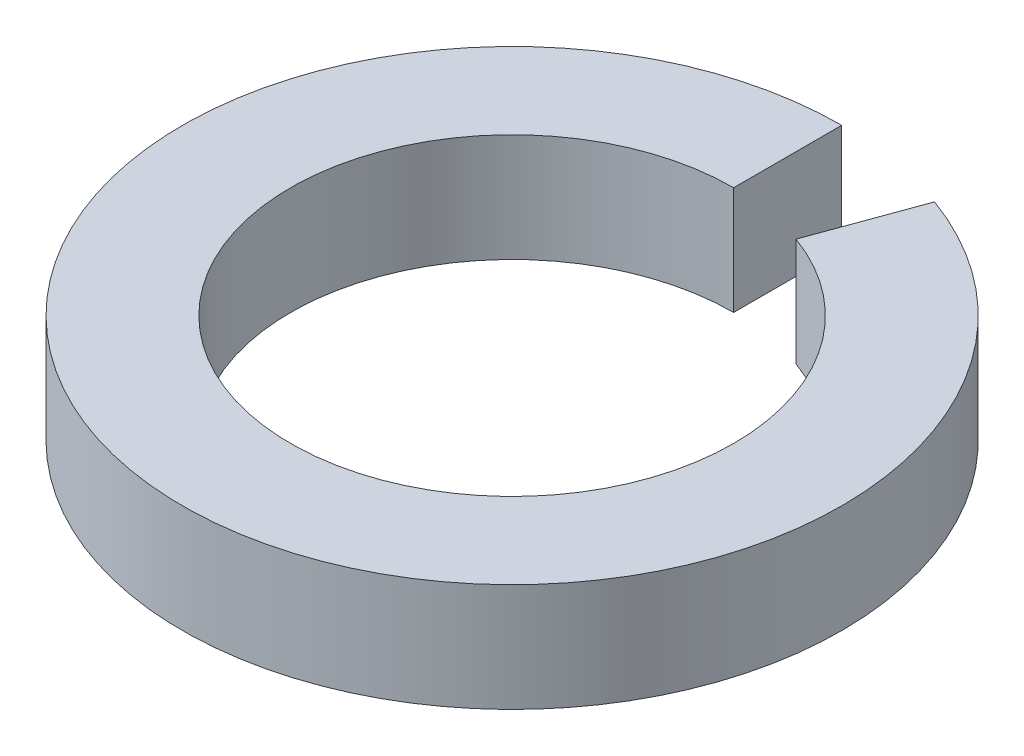
ISO-10303-21;
HEADER;
FILE_DESCRIPTION(('STEP AP214'),'2;1');
FILE_NAME('part.step','',(''),(''),'','','');
FILE_SCHEMA(('AUTOMOTIVE_DESIGN { 1 0 10303 214 1 1 1 1 }'));
ENDSEC;
DATA;
#1=APPLICATION_CONTEXT('core data for automotive mechanical design processes');
#2=APPLICATION_PROTOCOL_DEFINITION('international standard','automotive_design',2000,#1);
#3=PRODUCT_CONTEXT('',#1,'mechanical');
#4=PRODUCT('Part','Part','',(#3));
#5=PRODUCT_RELATED_PRODUCT_CATEGORY('part','',(#4));
#6=PRODUCT_DEFINITION_FORMATION('','',#4);
#7=PRODUCT_DEFINITION_CONTEXT('part definition',#1,'design');
#8=PRODUCT_DEFINITION('design','',#6,#7);
#9=PRODUCT_DEFINITION_SHAPE('','',#8);
#10=(LENGTH_UNIT() NAMED_UNIT(*) SI_UNIT(.MILLI.,.METRE.));
#11=(NAMED_UNIT(*) PLANE_ANGLE_UNIT() SI_UNIT($,.RADIAN.));
#12=(NAMED_UNIT(*) SI_UNIT($,.STERADIAN.) SOLID_ANGLE_UNIT());
#13=UNCERTAINTY_MEASURE_WITH_UNIT(LENGTH_MEASURE(1.E-05),#10,'distance_accuracy_value','');
#14=(GEOMETRIC_REPRESENTATION_CONTEXT(3) GLOBAL_UNCERTAINTY_ASSIGNED_CONTEXT((#13)) GLOBAL_UNIT_ASSIGNED_CONTEXT((#10,
#11,#12)) REPRESENTATION_CONTEXT('',''));
#15=CARTESIAN_POINT('',(0.,0.,0.));
#16=DIRECTION('',(0.,0.,1.));
#17=DIRECTION('',(1.,0.,0.));
#18=AXIS2_PLACEMENT_3D('',#15,#16,#17);
#19=CARTESIAN_POINT('',(0.,2.,0.));
#20=DIRECTION('',(0.,-1.,0.));
#21=DIRECTION('',(0.,0.,-1.));
#22=AXIS2_PLACEMENT_3D('',#19,#20,#21);
#23=CYLINDRICAL_SURFACE('',#22,4.1);
#24=CARTESIAN_POINT('',(0.,0.,0.));
#25=DIRECTION('',(0.,-1.,0.));
#26=DIRECTION('',(0.,0.,1.));
#27=AXIS2_PLACEMENT_3D('',#24,#25,#26);
#28=CIRCLE('',#27,4.1);
#29=CARTESIAN_POINT('',(1.40228258763524,0.,-3.85273974522222));
#30=VERTEX_POINT('',#29);
#31=CARTESIAN_POINT('',(0.,0.,-4.1));
#32=VERTEX_POINT('',#31);
#33=EDGE_CURVE('E94',#30,#32,#28,.T.);
#34=ORIENTED_EDGE('',*,*,#33,.T.);
#35=DIRECTION('',(0.,-1.,0.));
#36=VECTOR('',#35,1.);
#37=CARTESIAN_POINT('',(0.,2.,-4.1));
#38=LINE('',#37,#36);
#39=CARTESIAN_POINT('',(0.,2.,-4.1));
#40=VERTEX_POINT('',#39);
#41=EDGE_CURVE('E11',#40,#32,#38,.T.);
#42=ORIENTED_EDGE('',*,*,#41,.F.);
#43=CARTESIAN_POINT('',(0.,2.,0.));
#44=DIRECTION('',(0.,-1.,0.));
#45=DIRECTION('',(0.,0.,1.));
#46=AXIS2_PLACEMENT_3D('',#43,#44,#45);
#47=CIRCLE('',#46,4.1);
#48=CARTESIAN_POINT('',(1.40228258763524,2.,-3.85273974522222));
#49=VERTEX_POINT('',#48);
#50=EDGE_CURVE('E82',#49,#40,#47,.T.);
#51=ORIENTED_EDGE('',*,*,#50,.F.);
#52=DIRECTION('',(0.,-1.,0.));
#53=VECTOR('',#52,1.);
#54=CARTESIAN_POINT('',(1.40228258763524,2.,-3.85273974522222));
#55=LINE('',#54,#53);
#56=EDGE_CURVE('E90',#49,#30,#55,.T.);
#57=ORIENTED_EDGE('',*,*,#56,.T.);
#58=EDGE_LOOP('',(#34,#42,#51,#57));
#59=FACE_BOUND('',#58,.T.);
#60=ADVANCED_FACE('F31',(#59),#23,.F.);
#61=CARTESIAN_POINT('',(0.,2.,-4.1));
#62=DIRECTION('',(-1.,0.,0.));
#63=DIRECTION('',(0.,0.,1.));
#64=AXIS2_PLACEMENT_3D('',#61,#62,#63);
#65=PLANE('',#64);
#66=DIRECTION('',(0.,0.,-1.));
#67=VECTOR('',#66,1.);
#68=CARTESIAN_POINT('',(0.,0.,-4.1));
#69=LINE('',#68,#67);
#70=CARTESIAN_POINT('',(0.,0.,-6.1));
#71=VERTEX_POINT('',#70);
#72=EDGE_CURVE('E86',#32,#71,#69,.T.);
#73=ORIENTED_EDGE('',*,*,#72,.T.);
#74=DIRECTION('',(0.,-1.,0.));
#75=VECTOR('',#74,1.);
#76=CARTESIAN_POINT('',(0.,2.,-6.1));
#77=LINE('',#76,#75);
#78=CARTESIAN_POINT('',(0.,2.,-6.1));
#79=VERTEX_POINT('',#78);
#80=EDGE_CURVE('E39',#79,#71,#77,.T.);
#81=ORIENTED_EDGE('',*,*,#80,.F.);
#82=DIRECTION('',(0.,0.,-1.));
#83=VECTOR('',#82,1.);
#84=CARTESIAN_POINT('',(0.,2.,-4.1));
#85=LINE('',#84,#83);
#86=EDGE_CURVE('E77',#40,#79,#85,.T.);
#87=ORIENTED_EDGE('',*,*,#86,.F.);
#88=ORIENTED_EDGE('',*,*,#41,.T.);
#89=EDGE_LOOP('',(#73,#81,#87,#88));
#90=FACE_BOUND('',#89,.T.);
#91=ADVANCED_FACE('F85',(#90),#65,.F.);
#92=CARTESIAN_POINT('',(0.,2.,0.));
#93=DIRECTION('',(0.,-1.,0.));
#94=DIRECTION('',(0.,0.,-1.));
#95=AXIS2_PLACEMENT_3D('',#92,#93,#94);
#96=CYLINDRICAL_SURFACE('',#95,6.1);
#97=CARTESIAN_POINT('',(0.,0.,0.));
#98=DIRECTION('',(0.,1.,0.));
#99=DIRECTION('',(0.,0.,1.));
#100=AXIS2_PLACEMENT_3D('',#97,#98,#99);
#101=CIRCLE('',#100,6.1);
#102=CARTESIAN_POINT('',(2.08632287428658,0.,-5.73212498679404));
#103=VERTEX_POINT('',#102);
#104=EDGE_CURVE('E64',#71,#103,#101,.T.);
#105=ORIENTED_EDGE('',*,*,#104,.T.);
#106=DIRECTION('',(0.,-1.,0.));
#107=VECTOR('',#106,1.);
#108=CARTESIAN_POINT('',(2.08632287428658,2.,-5.73212498679404));
#109=LINE('',#108,#107);
#110=CARTESIAN_POINT('',(2.08632287428658,2.,-5.73212498679404));
#111=VERTEX_POINT('',#110);
#112=EDGE_CURVE('E87',#111,#103,#109,.T.);
#113=ORIENTED_EDGE('',*,*,#112,.F.);
#114=CARTESIAN_POINT('',(0.,2.,0.));
#115=DIRECTION('',(0.,1.,0.));
#116=DIRECTION('',(0.,0.,1.));
#117=AXIS2_PLACEMENT_3D('',#114,#115,#116);
#118=CIRCLE('',#117,6.1);
#119=EDGE_CURVE('E80',#79,#111,#118,.T.);
#120=ORIENTED_EDGE('',*,*,#119,.F.);
#121=ORIENTED_EDGE('',*,*,#80,.T.);
#122=EDGE_LOOP('',(#105,#113,#120,#121));
#123=FACE_BOUND('',#122,.T.);
#124=ADVANCED_FACE('F88',(#123),#96,.T.);
#125=CARTESIAN_POINT('',(1.40228258763524,2.,-3.85273974522222));
#126=DIRECTION('',(0.939692620785908,0.,0.342020143325669));
#127=DIRECTION('',(0.342020143325669,0.,-0.939692620785908));
#128=AXIS2_PLACEMENT_3D('',#125,#126,#127);
#129=PLANE('',#128);
#130=DIRECTION('',(-0.342020143325669,0.,0.939692620785908));
#131=VECTOR('',#130,1.);
#132=CARTESIAN_POINT('',(1.40228258763524,0.,-3.85273974522222));
#133=LINE('',#132,#131);
#134=EDGE_CURVE('E70',#103,#30,#133,.T.);
#135=ORIENTED_EDGE('',*,*,#134,.T.);
#136=ORIENTED_EDGE('',*,*,#56,.F.);
#137=DIRECTION('',(-0.342020143325669,0.,0.939692620785908));
#138=VECTOR('',#137,1.);
#139=CARTESIAN_POINT('',(1.40228258763524,2.,-3.85273974522222));
#140=LINE('',#139,#138);
#141=EDGE_CURVE('E47',#111,#49,#140,.T.);
#142=ORIENTED_EDGE('',*,*,#141,.F.);
#143=ORIENTED_EDGE('',*,*,#112,.T.);
#144=EDGE_LOOP('',(#135,#136,#142,#143));
#145=FACE_BOUND('',#144,.T.);
#146=ADVANCED_FACE('F101',(#145),#129,.F.);
#147=CARTESIAN_POINT('',(0.,2.,0.));
#148=DIRECTION('',(0.,1.,0.));
#149=DIRECTION('',(0.,0.,1.));
#150=AXIS2_PLACEMENT_3D('',#147,#148,#149);
#151=PLANE('',#150);
#152=ORIENTED_EDGE('',*,*,#50,.T.);
#153=ORIENTED_EDGE('',*,*,#86,.T.);
#154=ORIENTED_EDGE('',*,*,#119,.T.);
#155=ORIENTED_EDGE('',*,*,#141,.T.);
#156=EDGE_LOOP('',(#152,#153,#154,#155));
#157=FACE_BOUND('',#156,.T.);
#158=ADVANCED_FACE('F78',(#157),#151,.T.);
#159=CARTESIAN_POINT('',(0.,0.,0.));
#160=DIRECTION('',(0.,1.,0.));
#161=DIRECTION('',(0.,0.,1.));
#162=AXIS2_PLACEMENT_3D('',#159,#160,#161);
#163=PLANE('',#162);
#164=ORIENTED_EDGE('',*,*,#33,.F.);
#165=ORIENTED_EDGE('',*,*,#134,.F.);
#166=ORIENTED_EDGE('',*,*,#104,.F.);
#167=ORIENTED_EDGE('',*,*,#72,.F.);
#168=EDGE_LOOP('',(#164,#165,#166,#167));
#169=FACE_BOUND('',#168,.T.);
#170=ADVANCED_FACE('F104',(#169),#163,.F.);
#171=CLOSED_SHELL('',(#60,#91,#124,#146,#158,#170));
#172=MANIFOLD_SOLID_BREP('B2',#171);
#173=ADVANCED_BREP_SHAPE_REPRESENTATION('',(#18,#172),#14);
#174=SHAPE_DEFINITION_REPRESENTATION(#9,#173);
ENDSEC;
END-ISO-10303-21;
